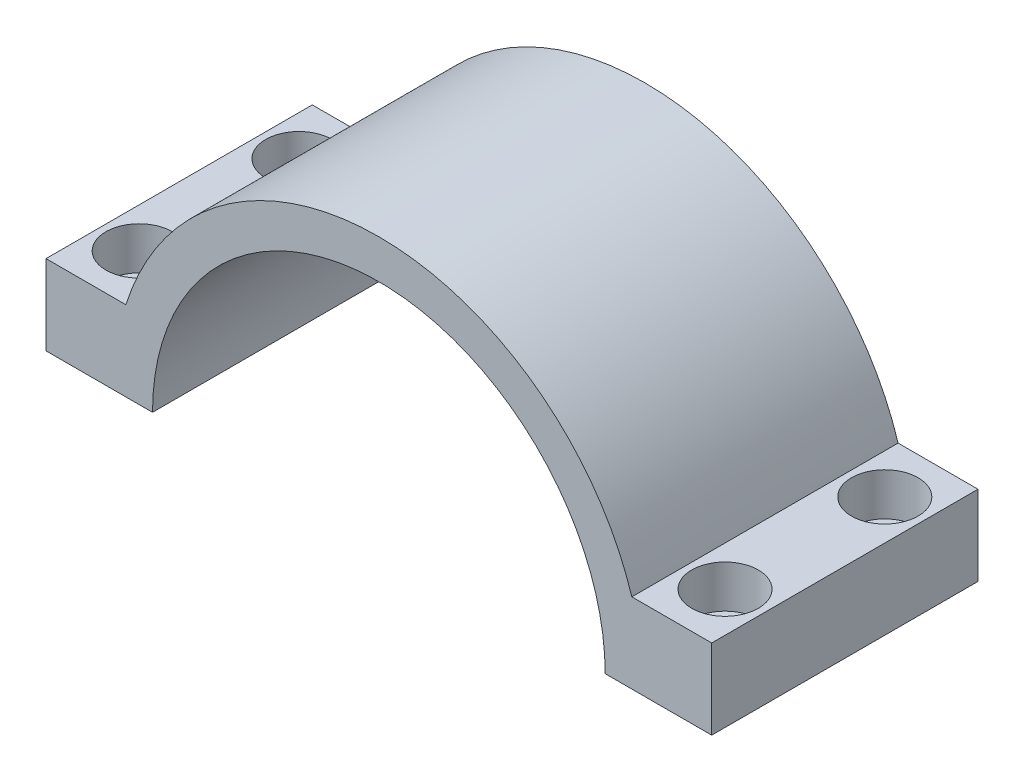
ISO-10303-21;
HEADER;
FILE_DESCRIPTION(('STEP AP214'),'2;1');
FILE_NAME('part.step','',(''),(''),'','','');
FILE_SCHEMA(('AUTOMOTIVE_DESIGN { 1 0 10303 214 1 1 1 1 }'));
ENDSEC;
DATA;
#1=APPLICATION_CONTEXT('core data for automotive mechanical design processes');
#2=APPLICATION_PROTOCOL_DEFINITION('international standard','automotive_design',2000,#1);
#3=PRODUCT_CONTEXT('',#1,'mechanical');
#4=PRODUCT('Part','Part','',(#3));
#5=PRODUCT_RELATED_PRODUCT_CATEGORY('part','',(#4));
#6=PRODUCT_DEFINITION_FORMATION('','',#4);
#7=PRODUCT_DEFINITION_CONTEXT('part definition',#1,'design');
#8=PRODUCT_DEFINITION('design','',#6,#7);
#9=PRODUCT_DEFINITION_SHAPE('','',#8);
#10=(LENGTH_UNIT() NAMED_UNIT(*) SI_UNIT(.MILLI.,.METRE.));
#11=(NAMED_UNIT(*) PLANE_ANGLE_UNIT() SI_UNIT($,.RADIAN.));
#12=(NAMED_UNIT(*) SI_UNIT($,.STERADIAN.) SOLID_ANGLE_UNIT());
#13=UNCERTAINTY_MEASURE_WITH_UNIT(LENGTH_MEASURE(1.E-05),#10,'distance_accuracy_value','');
#14=(GEOMETRIC_REPRESENTATION_CONTEXT(3) GLOBAL_UNCERTAINTY_ASSIGNED_CONTEXT((#13)) GLOBAL_UNIT_ASSIGNED_CONTEXT((#10,
#11,#12)) REPRESENTATION_CONTEXT('',''));
#15=CARTESIAN_POINT('',(0.,0.,0.));
#16=DIRECTION('',(0.,0.,1.));
#17=DIRECTION('',(1.,0.,0.));
#18=AXIS2_PLACEMENT_3D('',#15,#16,#17);
#19=CARTESIAN_POINT('',(0.,0.,10.));
#20=DIRECTION('',(0.,0.,-1.));
#21=DIRECTION('',(-1.,0.,0.));
#22=AXIS2_PLACEMENT_3D('',#19,#20,#21);
#23=CYLINDRICAL_SURFACE('',#22,9.96242942258564);
#24=CARTESIAN_POINT('',(0.,0.,0.));
#25=DIRECTION('',(0.,0.,1.));
#26=DIRECTION('',(1.,0.,0.));
#27=AXIS2_PLACEMENT_3D('',#24,#25,#26);
#28=CIRCLE('',#27,9.96242942258564);
#29=CARTESIAN_POINT('',(-9.5,3.,0.));
#30=VERTEX_POINT('',#29);
#31=CARTESIAN_POINT('',(9.5,3.,0.));
#32=VERTEX_POINT('',#31);
#33=EDGE_CURVE('E126',#30,#32,#28,.F.);
#34=ORIENTED_EDGE('',*,*,#33,.F.);
#35=DIRECTION('',(0.,0.,-1.));
#36=VECTOR('',#35,1.);
#37=CARTESIAN_POINT('',(-9.5,3.,10.));
#38=LINE('',#37,#36);
#39=CARTESIAN_POINT('',(-9.5,3.,10.));
#40=VERTEX_POINT('',#39);
#41=EDGE_CURVE('E11',#40,#30,#38,.T.);
#42=ORIENTED_EDGE('',*,*,#41,.F.);
#43=CARTESIAN_POINT('',(0.,0.,10.));
#44=DIRECTION('',(0.,0.,1.));
#45=DIRECTION('',(1.,0.,0.));
#46=AXIS2_PLACEMENT_3D('',#43,#44,#45);
#47=CIRCLE('',#46,9.96242942258564);
#48=CARTESIAN_POINT('',(9.5,3.,10.));
#49=VERTEX_POINT('',#48);
#50=EDGE_CURVE('E146',#40,#49,#47,.F.);
#51=ORIENTED_EDGE('',*,*,#50,.T.);
#52=DIRECTION('',(0.,0.,-1.));
#53=VECTOR('',#52,1.);
#54=CARTESIAN_POINT('',(9.5,3.,10.));
#55=LINE('',#54,#53);
#56=EDGE_CURVE('E85',#49,#32,#55,.T.);
#57=ORIENTED_EDGE('',*,*,#56,.T.);
#58=EDGE_LOOP('',(#34,#42,#51,#57));
#59=FACE_BOUND('',#58,.T.);
#60=ADVANCED_FACE('F34',(#59),#23,.T.);
#61=CARTESIAN_POINT('',(0.,3.,10.));
#62=DIRECTION('',(0.,1.,0.));
#63=DIRECTION('',(-1.,0.,0.));
#64=AXIS2_PLACEMENT_3D('',#61,#62,#63);
#65=PLANE('',#64);
#66=CARTESIAN_POINT('',(-11.,3.,2.));
#67=DIRECTION('',(0.,1.,0.));
#68=DIRECTION('',(0.,0.,1.));
#69=AXIS2_PLACEMENT_3D('',#66,#67,#68);
#70=CIRCLE('',#69,1.25);
#71=CARTESIAN_POINT('',(-11.,3.,3.25));
#72=VERTEX_POINT('',#71);
#73=EDGE_CURVE('E227',#72,#72,#70,.T.);
#74=ORIENTED_EDGE('',*,*,#73,.F.);
#75=EDGE_LOOP('',(#74));
#76=FACE_BOUND('',#75,.T.);
#77=CARTESIAN_POINT('',(-11.,3.,8.));
#78=DIRECTION('',(0.,1.,0.));
#79=DIRECTION('',(0.,0.,1.));
#80=AXIS2_PLACEMENT_3D('',#77,#78,#79);
#81=CIRCLE('',#80,1.25);
#82=CARTESIAN_POINT('',(-11.,3.,9.25));
#83=VERTEX_POINT('',#82);
#84=EDGE_CURVE('E215',#83,#83,#81,.T.);
#85=ORIENTED_EDGE('',*,*,#84,.F.);
#86=EDGE_LOOP('',(#85));
#87=FACE_BOUND('',#86,.T.);
#88=DIRECTION('',(1.,0.,0.));
#89=VECTOR('',#88,1.);
#90=CARTESIAN_POINT('',(0.,3.,0.));
#91=LINE('',#90,#89);
#92=CARTESIAN_POINT('',(-12.5,3.,0.));
#93=VERTEX_POINT('',#92);
#94=EDGE_CURVE('E129',#93,#30,#91,.T.);
#95=ORIENTED_EDGE('',*,*,#94,.F.);
#96=DIRECTION('',(0.,0.,-1.));
#97=VECTOR('',#96,1.);
#98=CARTESIAN_POINT('',(-12.5,3.,10.));
#99=LINE('',#98,#97);
#100=CARTESIAN_POINT('',(-12.5,3.,10.));
#101=VERTEX_POINT('',#100);
#102=EDGE_CURVE('E42',#101,#93,#99,.T.);
#103=ORIENTED_EDGE('',*,*,#102,.F.);
#104=DIRECTION('',(1.,0.,0.));
#105=VECTOR('',#104,1.);
#106=CARTESIAN_POINT('',(0.,3.,10.));
#107=LINE('',#106,#105);
#108=EDGE_CURVE('E172',#101,#40,#107,.T.);
#109=ORIENTED_EDGE('',*,*,#108,.T.);
#110=ORIENTED_EDGE('',*,*,#41,.T.);
#111=EDGE_LOOP('',(#95,#103,#109,#110));
#112=FACE_BOUND('',#111,.T.);
#113=ADVANCED_FACE('F163',(#76,#87,#112),#65,.T.);
#114=CARTESIAN_POINT('',(-12.5,0.,10.));
#115=DIRECTION('',(-1.,0.,0.));
#116=DIRECTION('',(0.,0.,1.));
#117=AXIS2_PLACEMENT_3D('',#114,#115,#116);
#118=PLANE('',#117);
#119=DIRECTION('',(0.,1.,0.));
#120=VECTOR('',#119,1.);
#121=CARTESIAN_POINT('',(-12.5,0.,0.));
#122=LINE('',#121,#120);
#123=CARTESIAN_POINT('',(-12.5,0.,0.));
#124=VERTEX_POINT('',#123);
#125=EDGE_CURVE('E133',#124,#93,#122,.T.);
#126=ORIENTED_EDGE('',*,*,#125,.F.);
#127=DIRECTION('',(0.,0.,-1.));
#128=VECTOR('',#127,1.);
#129=CARTESIAN_POINT('',(-12.5,0.,10.));
#130=LINE('',#129,#128);
#131=CARTESIAN_POINT('',(-12.5,0.,10.));
#132=VERTEX_POINT('',#131);
#133=EDGE_CURVE('E152',#132,#124,#130,.T.);
#134=ORIENTED_EDGE('',*,*,#133,.F.);
#135=DIRECTION('',(0.,1.,0.));
#136=VECTOR('',#135,1.);
#137=CARTESIAN_POINT('',(-12.5,0.,10.));
#138=LINE('',#137,#136);
#139=EDGE_CURVE('E159',#132,#101,#138,.T.);
#140=ORIENTED_EDGE('',*,*,#139,.T.);
#141=ORIENTED_EDGE('',*,*,#102,.T.);
#142=EDGE_LOOP('',(#126,#134,#140,#141));
#143=FACE_BOUND('',#142,.T.);
#144=ADVANCED_FACE('F157',(#143),#118,.T.);
#145=CARTESIAN_POINT('',(0.,0.,10.));
#146=DIRECTION('',(0.,-1.,0.));
#147=DIRECTION('',(1.,0.,0.));
#148=AXIS2_PLACEMENT_3D('',#145,#146,#147);
#149=PLANE('',#148);
#150=CARTESIAN_POINT('',(-11.,0.,2.));
#151=DIRECTION('',(0.,1.,0.));
#152=DIRECTION('',(0.,0.,1.));
#153=AXIS2_PLACEMENT_3D('',#150,#151,#152);
#154=CIRCLE('',#153,0.999999999999999);
#155=CARTESIAN_POINT('',(-11.,0.,3.));
#156=VERTEX_POINT('',#155);
#157=EDGE_CURVE('E218',#156,#156,#154,.T.);
#158=ORIENTED_EDGE('',*,*,#157,.T.);
#159=EDGE_LOOP('',(#158));
#160=FACE_BOUND('',#159,.T.);
#161=CARTESIAN_POINT('',(-11.,0.,8.));
#162=DIRECTION('',(0.,1.,0.));
#163=DIRECTION('',(0.,0.,1.));
#164=AXIS2_PLACEMENT_3D('',#161,#162,#163);
#165=CIRCLE('',#164,0.999999999999999);
#166=CARTESIAN_POINT('',(-11.,0.,9.));
#167=VERTEX_POINT('',#166);
#168=EDGE_CURVE('E206',#167,#167,#165,.T.);
#169=ORIENTED_EDGE('',*,*,#168,.T.);
#170=EDGE_LOOP('',(#169));
#171=FACE_BOUND('',#170,.T.);
#172=DIRECTION('',(-1.,0.,0.));
#173=VECTOR('',#172,1.);
#174=CARTESIAN_POINT('',(0.,0.,0.));
#175=LINE('',#174,#173);
#176=CARTESIAN_POINT('',(-8.5,0.,0.));
#177=VERTEX_POINT('',#176);
#178=EDGE_CURVE('E136',#177,#124,#175,.T.);
#179=ORIENTED_EDGE('',*,*,#178,.F.);
#180=DIRECTION('',(0.,0.,-1.));
#181=VECTOR('',#180,1.);
#182=CARTESIAN_POINT('',(-8.5,0.,10.));
#183=LINE('',#182,#181);
#184=CARTESIAN_POINT('',(-8.5,0.,10.));
#185=VERTEX_POINT('',#184);
#186=EDGE_CURVE('E150',#185,#177,#183,.T.);
#187=ORIENTED_EDGE('',*,*,#186,.F.);
#188=DIRECTION('',(-1.,0.,0.));
#189=VECTOR('',#188,1.);
#190=CARTESIAN_POINT('',(0.,0.,10.));
#191=LINE('',#190,#189);
#192=EDGE_CURVE('E171',#185,#132,#191,.T.);
#193=ORIENTED_EDGE('',*,*,#192,.T.);
#194=ORIENTED_EDGE('',*,*,#133,.T.);
#195=EDGE_LOOP('',(#179,#187,#193,#194));
#196=FACE_BOUND('',#195,.T.);
#197=ADVANCED_FACE('F169',(#160,#171,#196),#149,.T.);
#198=CARTESIAN_POINT('',(0.,0.,10.));
#199=DIRECTION('',(0.,0.,-1.));
#200=DIRECTION('',(-1.,0.,0.));
#201=AXIS2_PLACEMENT_3D('',#198,#199,#200);
#202=CYLINDRICAL_SURFACE('',#201,8.5);
#203=CARTESIAN_POINT('',(0.,0.,0.));
#204=DIRECTION('',(0.,0.,1.));
#205=DIRECTION('',(1.,0.,0.));
#206=AXIS2_PLACEMENT_3D('',#203,#204,#205);
#207=CIRCLE('',#206,8.5);
#208=CARTESIAN_POINT('',(8.5,0.,0.));
#209=VERTEX_POINT('',#208);
#210=EDGE_CURVE('E139',#209,#177,#207,.T.);
#211=ORIENTED_EDGE('',*,*,#210,.F.);
#212=DIRECTION('',(0.,0.,-1.));
#213=VECTOR('',#212,1.);
#214=CARTESIAN_POINT('',(8.5,0.,10.));
#215=LINE('',#214,#213);
#216=CARTESIAN_POINT('',(8.5,0.,10.));
#217=VERTEX_POINT('',#216);
#218=EDGE_CURVE('E118',#217,#209,#215,.T.);
#219=ORIENTED_EDGE('',*,*,#218,.F.);
#220=CARTESIAN_POINT('',(0.,0.,10.));
#221=DIRECTION('',(0.,0.,1.));
#222=DIRECTION('',(1.,0.,0.));
#223=AXIS2_PLACEMENT_3D('',#220,#221,#222);
#224=CIRCLE('',#223,8.5);
#225=EDGE_CURVE('E111',#217,#185,#224,.T.);
#226=ORIENTED_EDGE('',*,*,#225,.T.);
#227=ORIENTED_EDGE('',*,*,#186,.T.);
#228=EDGE_LOOP('',(#211,#219,#226,#227));
#229=FACE_BOUND('',#228,.T.);
#230=ADVANCED_FACE('F178',(#229),#202,.F.);
#231=CARTESIAN_POINT('',(0.,0.,10.));
#232=DIRECTION('',(0.,1.,0.));
#233=DIRECTION('',(-1.,0.,0.));
#234=AXIS2_PLACEMENT_3D('',#231,#232,#233);
#235=PLANE('',#234);
#236=CARTESIAN_POINT('',(11.,0.,2.));
#237=DIRECTION('',(0.,1.,0.));
#238=DIRECTION('',(0.,0.,1.));
#239=AXIS2_PLACEMENT_3D('',#236,#237,#238);
#240=CIRCLE('',#239,0.999999999999999);
#241=CARTESIAN_POINT('',(11.,0.,3.));
#242=VERTEX_POINT('',#241);
#243=EDGE_CURVE('E194',#242,#242,#240,.T.);
#244=ORIENTED_EDGE('',*,*,#243,.T.);
#245=EDGE_LOOP('',(#244));
#246=FACE_BOUND('',#245,.T.);
#247=CARTESIAN_POINT('',(11.,0.,8.));
#248=DIRECTION('',(0.,1.,0.));
#249=DIRECTION('',(0.,0.,1.));
#250=AXIS2_PLACEMENT_3D('',#247,#248,#249);
#251=CIRCLE('',#250,0.999999999999999);
#252=CARTESIAN_POINT('',(11.,0.,9.));
#253=VERTEX_POINT('',#252);
#254=EDGE_CURVE('E130',#253,#253,#251,.T.);
#255=ORIENTED_EDGE('',*,*,#254,.T.);
#256=EDGE_LOOP('',(#255));
#257=FACE_BOUND('',#256,.T.);
#258=DIRECTION('',(1.,0.,0.));
#259=VECTOR('',#258,1.);
#260=CARTESIAN_POINT('',(0.,0.,0.));
#261=LINE('',#260,#259);
#262=CARTESIAN_POINT('',(12.5,0.,0.));
#263=VERTEX_POINT('',#262);
#264=EDGE_CURVE('E117',#209,#263,#261,.T.);
#265=ORIENTED_EDGE('',*,*,#264,.T.);
#266=DIRECTION('',(0.,0.,-1.));
#267=VECTOR('',#266,1.);
#268=CARTESIAN_POINT('',(12.5,0.,10.));
#269=LINE('',#268,#267);
#270=CARTESIAN_POINT('',(12.5,0.,10.));
#271=VERTEX_POINT('',#270);
#272=EDGE_CURVE('E114',#271,#263,#269,.T.);
#273=ORIENTED_EDGE('',*,*,#272,.F.);
#274=DIRECTION('',(1.,0.,0.));
#275=VECTOR('',#274,1.);
#276=CARTESIAN_POINT('',(0.,0.,10.));
#277=LINE('',#276,#275);
#278=EDGE_CURVE('E104',#217,#271,#277,.T.);
#279=ORIENTED_EDGE('',*,*,#278,.F.);
#280=ORIENTED_EDGE('',*,*,#218,.T.);
#281=EDGE_LOOP('',(#265,#273,#279,#280));
#282=FACE_BOUND('',#281,.T.);
#283=ADVANCED_FACE('F115',(#246,#257,#282),#235,.F.);
#284=CARTESIAN_POINT('',(12.5,0.,10.));
#285=DIRECTION('',(-1.,0.,0.));
#286=DIRECTION('',(0.,0.,1.));
#287=AXIS2_PLACEMENT_3D('',#284,#285,#286);
#288=PLANE('',#287);
#289=DIRECTION('',(0.,1.,0.));
#290=VECTOR('',#289,1.);
#291=CARTESIAN_POINT('',(12.5,0.,0.));
#292=LINE('',#291,#290);
#293=CARTESIAN_POINT('',(12.5,3.,0.));
#294=VERTEX_POINT('',#293);
#295=EDGE_CURVE('E78',#263,#294,#292,.T.);
#296=ORIENTED_EDGE('',*,*,#295,.T.);
#297=DIRECTION('',(0.,0.,-1.));
#298=VECTOR('',#297,1.);
#299=CARTESIAN_POINT('',(12.5,3.,10.));
#300=LINE('',#299,#298);
#301=CARTESIAN_POINT('',(12.5,3.,10.));
#302=VERTEX_POINT('',#301);
#303=EDGE_CURVE('E119',#302,#294,#300,.T.);
#304=ORIENTED_EDGE('',*,*,#303,.F.);
#305=DIRECTION('',(0.,1.,0.));
#306=VECTOR('',#305,1.);
#307=CARTESIAN_POINT('',(12.5,0.,10.));
#308=LINE('',#307,#306);
#309=EDGE_CURVE('E108',#271,#302,#308,.T.);
#310=ORIENTED_EDGE('',*,*,#309,.F.);
#311=ORIENTED_EDGE('',*,*,#272,.T.);
#312=EDGE_LOOP('',(#296,#304,#310,#311));
#313=FACE_BOUND('',#312,.T.);
#314=ADVANCED_FACE('F121',(#313),#288,.F.);
#315=CARTESIAN_POINT('',(0.,3.,10.));
#316=DIRECTION('',(0.,-1.,0.));
#317=DIRECTION('',(1.,0.,0.));
#318=AXIS2_PLACEMENT_3D('',#315,#316,#317);
#319=PLANE('',#318);
#320=CARTESIAN_POINT('',(11.,3.,2.));
#321=DIRECTION('',(0.,1.,0.));
#322=DIRECTION('',(0.,0.,1.));
#323=AXIS2_PLACEMENT_3D('',#320,#321,#322);
#324=CIRCLE('',#323,1.25);
#325=CARTESIAN_POINT('',(11.,3.,3.25));
#326=VERTEX_POINT('',#325);
#327=EDGE_CURVE('E203',#326,#326,#324,.T.);
#328=ORIENTED_EDGE('',*,*,#327,.F.);
#329=EDGE_LOOP('',(#328));
#330=FACE_BOUND('',#329,.T.);
#331=CARTESIAN_POINT('',(11.,3.,8.));
#332=DIRECTION('',(0.,1.,0.));
#333=DIRECTION('',(0.,0.,1.));
#334=AXIS2_PLACEMENT_3D('',#331,#332,#333);
#335=CIRCLE('',#334,1.25);
#336=CARTESIAN_POINT('',(11.,3.,9.25));
#337=VERTEX_POINT('',#336);
#338=EDGE_CURVE('E191',#337,#337,#335,.T.);
#339=ORIENTED_EDGE('',*,*,#338,.F.);
#340=EDGE_LOOP('',(#339));
#341=FACE_BOUND('',#340,.T.);
#342=DIRECTION('',(-1.,0.,0.));
#343=VECTOR('',#342,1.);
#344=CARTESIAN_POINT('',(0.,3.,0.));
#345=LINE('',#344,#343);
#346=EDGE_CURVE('E144',#294,#32,#345,.T.);
#347=ORIENTED_EDGE('',*,*,#346,.T.);
#348=ORIENTED_EDGE('',*,*,#56,.F.);
#349=DIRECTION('',(-1.,0.,0.));
#350=VECTOR('',#349,1.);
#351=CARTESIAN_POINT('',(0.,3.,10.));
#352=LINE('',#351,#350);
#353=EDGE_CURVE('E50',#302,#49,#352,.T.);
#354=ORIENTED_EDGE('',*,*,#353,.F.);
#355=ORIENTED_EDGE('',*,*,#303,.T.);
#356=EDGE_LOOP('',(#347,#348,#354,#355));
#357=FACE_BOUND('',#356,.T.);
#358=ADVANCED_FACE('F181',(#330,#341,#357),#319,.F.);
#359=CARTESIAN_POINT('',(0.,0.,10.));
#360=DIRECTION('',(0.,0.,1.));
#361=DIRECTION('',(1.,0.,0.));
#362=AXIS2_PLACEMENT_3D('',#359,#360,#361);
#363=PLANE('',#362);
#364=ORIENTED_EDGE('',*,*,#50,.F.);
#365=ORIENTED_EDGE('',*,*,#108,.F.);
#366=ORIENTED_EDGE('',*,*,#139,.F.);
#367=ORIENTED_EDGE('',*,*,#192,.F.);
#368=ORIENTED_EDGE('',*,*,#225,.F.);
#369=ORIENTED_EDGE('',*,*,#278,.T.);
#370=ORIENTED_EDGE('',*,*,#309,.T.);
#371=ORIENTED_EDGE('',*,*,#353,.T.);
#372=EDGE_LOOP('',(#364,#365,#366,#367,#368,#369,#370,#371));
#373=FACE_BOUND('',#372,.T.);
#374=ADVANCED_FACE('F106',(#373),#363,.T.);
#375=CARTESIAN_POINT('',(0.,0.,0.));
#376=DIRECTION('',(0.,0.,1.));
#377=DIRECTION('',(1.,0.,0.));
#378=AXIS2_PLACEMENT_3D('',#375,#376,#377);
#379=PLANE('',#378);
#380=ORIENTED_EDGE('',*,*,#33,.T.);
#381=ORIENTED_EDGE('',*,*,#346,.F.);
#382=ORIENTED_EDGE('',*,*,#295,.F.);
#383=ORIENTED_EDGE('',*,*,#264,.F.);
#384=ORIENTED_EDGE('',*,*,#210,.T.);
#385=ORIENTED_EDGE('',*,*,#178,.T.);
#386=ORIENTED_EDGE('',*,*,#125,.T.);
#387=ORIENTED_EDGE('',*,*,#94,.T.);
#388=EDGE_LOOP('',(#380,#381,#382,#383,#384,#385,#386,#387));
#389=FACE_BOUND('',#388,.T.);
#390=ADVANCED_FACE('F165',(#389),#379,.F.);
#391=CARTESIAN_POINT('',(11.,3.,8.));
#392=DIRECTION('',(0.,1.,0.));
#393=DIRECTION('',(0.,0.,1.));
#394=AXIS2_PLACEMENT_3D('',#391,#392,#393);
#395=CYLINDRICAL_SURFACE('',#394,0.999999999999999);
#396=ORIENTED_EDGE('',*,*,#254,.F.);
#397=EDGE_LOOP('',(#396));
#398=FACE_BOUND('',#397,.T.);
#399=CARTESIAN_POINT('',(11.,1.4,8.));
#400=DIRECTION('',(0.,1.,0.));
#401=DIRECTION('',(0.,0.,1.));
#402=AXIS2_PLACEMENT_3D('',#399,#400,#401);
#403=CIRCLE('',#402,0.999999999999999);
#404=CARTESIAN_POINT('',(11.,1.4,9.));
#405=VERTEX_POINT('',#404);
#406=EDGE_CURVE('E185',#405,#405,#403,.T.);
#407=ORIENTED_EDGE('',*,*,#406,.T.);
#408=EDGE_LOOP('',(#407));
#409=FACE_BOUND('',#408,.T.);
#410=ADVANCED_FACE('F313',(#398,#409),#395,.F.);
#411=CARTESIAN_POINT('',(12.,1.4,8.));
#412=DIRECTION('',(0.,-1.,0.));
#413=DIRECTION('',(0.,0.,-1.));
#414=AXIS2_PLACEMENT_3D('',#411,#412,#413);
#415=PLANE('',#414);
#416=ORIENTED_EDGE('',*,*,#406,.F.);
#417=EDGE_LOOP('',(#416));
#418=FACE_BOUND('',#417,.T.);
#419=CARTESIAN_POINT('',(11.,1.4,8.));
#420=DIRECTION('',(0.,1.,0.));
#421=DIRECTION('',(0.,0.,1.));
#422=AXIS2_PLACEMENT_3D('',#419,#420,#421);
#423=CIRCLE('',#422,1.25);
#424=CARTESIAN_POINT('',(11.,1.4,9.25));
#425=VERTEX_POINT('',#424);
#426=EDGE_CURVE('E188',#425,#425,#423,.T.);
#427=ORIENTED_EDGE('',*,*,#426,.T.);
#428=EDGE_LOOP('',(#427));
#429=FACE_BOUND('',#428,.T.);
#430=ADVANCED_FACE('F319',(#418,#429),#415,.F.);
#431=CARTESIAN_POINT('',(11.,3.,8.));
#432=DIRECTION('',(0.,1.,0.));
#433=DIRECTION('',(0.,0.,1.));
#434=AXIS2_PLACEMENT_3D('',#431,#432,#433);
#435=CYLINDRICAL_SURFACE('',#434,1.25);
#436=ORIENTED_EDGE('',*,*,#426,.F.);
#437=EDGE_LOOP('',(#436));
#438=FACE_BOUND('',#437,.T.);
#439=ORIENTED_EDGE('',*,*,#338,.T.);
#440=EDGE_LOOP('',(#439));
#441=FACE_BOUND('',#440,.T.);
#442=ADVANCED_FACE('F327',(#438,#441),#435,.F.);
#443=CARTESIAN_POINT('',(11.,3.,2.));
#444=DIRECTION('',(0.,1.,0.));
#445=DIRECTION('',(0.,0.,1.));
#446=AXIS2_PLACEMENT_3D('',#443,#444,#445);
#447=CYLINDRICAL_SURFACE('',#446,0.999999999999999);
#448=ORIENTED_EDGE('',*,*,#243,.F.);
#449=EDGE_LOOP('',(#448));
#450=FACE_BOUND('',#449,.T.);
#451=CARTESIAN_POINT('',(11.,1.4,2.));
#452=DIRECTION('',(0.,1.,0.));
#453=DIRECTION('',(0.,0.,1.));
#454=AXIS2_PLACEMENT_3D('',#451,#452,#453);
#455=CIRCLE('',#454,0.999999999999999);
#456=CARTESIAN_POINT('',(11.,1.4,3.));
#457=VERTEX_POINT('',#456);
#458=EDGE_CURVE('E197',#457,#457,#455,.T.);
#459=ORIENTED_EDGE('',*,*,#458,.T.);
#460=EDGE_LOOP('',(#459));
#461=FACE_BOUND('',#460,.T.);
#462=ADVANCED_FACE('F335',(#450,#461),#447,.F.);
#463=CARTESIAN_POINT('',(12.,1.4,2.));
#464=DIRECTION('',(0.,-1.,0.));
#465=DIRECTION('',(0.,0.,-1.));
#466=AXIS2_PLACEMENT_3D('',#463,#464,#465);
#467=PLANE('',#466);
#468=ORIENTED_EDGE('',*,*,#458,.F.);
#469=EDGE_LOOP('',(#468));
#470=FACE_BOUND('',#469,.T.);
#471=CARTESIAN_POINT('',(11.,1.4,2.));
#472=DIRECTION('',(0.,1.,0.));
#473=DIRECTION('',(0.,0.,1.));
#474=AXIS2_PLACEMENT_3D('',#471,#472,#473);
#475=CIRCLE('',#474,1.25);
#476=CARTESIAN_POINT('',(11.,1.4,3.25));
#477=VERTEX_POINT('',#476);
#478=EDGE_CURVE('E200',#477,#477,#475,.T.);
#479=ORIENTED_EDGE('',*,*,#478,.T.);
#480=EDGE_LOOP('',(#479));
#481=FACE_BOUND('',#480,.T.);
#482=ADVANCED_FACE('F343',(#470,#481),#467,.F.);
#483=CARTESIAN_POINT('',(11.,3.,2.));
#484=DIRECTION('',(0.,1.,0.));
#485=DIRECTION('',(0.,0.,1.));
#486=AXIS2_PLACEMENT_3D('',#483,#484,#485);
#487=CYLINDRICAL_SURFACE('',#486,1.25);
#488=ORIENTED_EDGE('',*,*,#478,.F.);
#489=EDGE_LOOP('',(#488));
#490=FACE_BOUND('',#489,.T.);
#491=ORIENTED_EDGE('',*,*,#327,.T.);
#492=EDGE_LOOP('',(#491));
#493=FACE_BOUND('',#492,.T.);
#494=ADVANCED_FACE('F351',(#490,#493),#487,.F.);
#495=CARTESIAN_POINT('',(-11.,3.,8.));
#496=DIRECTION('',(0.,1.,0.));
#497=DIRECTION('',(0.,0.,1.));
#498=AXIS2_PLACEMENT_3D('',#495,#496,#497);
#499=CYLINDRICAL_SURFACE('',#498,0.999999999999999);
#500=ORIENTED_EDGE('',*,*,#168,.F.);
#501=EDGE_LOOP('',(#500));
#502=FACE_BOUND('',#501,.T.);
#503=CARTESIAN_POINT('',(-11.,1.4,8.));
#504=DIRECTION('',(0.,1.,0.));
#505=DIRECTION('',(0.,0.,1.));
#506=AXIS2_PLACEMENT_3D('',#503,#504,#505);
#507=CIRCLE('',#506,0.999999999999999);
#508=CARTESIAN_POINT('',(-11.,1.4,9.));
#509=VERTEX_POINT('',#508);
#510=EDGE_CURVE('E209',#509,#509,#507,.T.);
#511=ORIENTED_EDGE('',*,*,#510,.T.);
#512=EDGE_LOOP('',(#511));
#513=FACE_BOUND('',#512,.T.);
#514=ADVANCED_FACE('F250',(#502,#513),#499,.F.);
#515=CARTESIAN_POINT('',(-10.,1.4,8.));
#516=DIRECTION('',(0.,-1.,0.));
#517=DIRECTION('',(0.,0.,-1.));
#518=AXIS2_PLACEMENT_3D('',#515,#516,#517);
#519=PLANE('',#518);
#520=ORIENTED_EDGE('',*,*,#510,.F.);
#521=EDGE_LOOP('',(#520));
#522=FACE_BOUND('',#521,.T.);
#523=CARTESIAN_POINT('',(-11.,1.4,8.));
#524=DIRECTION('',(0.,1.,0.));
#525=DIRECTION('',(0.,0.,1.));
#526=AXIS2_PLACEMENT_3D('',#523,#524,#525);
#527=CIRCLE('',#526,1.25);
#528=CARTESIAN_POINT('',(-11.,1.4,9.25));
#529=VERTEX_POINT('',#528);
#530=EDGE_CURVE('E212',#529,#529,#527,.T.);
#531=ORIENTED_EDGE('',*,*,#530,.T.);
#532=EDGE_LOOP('',(#531));
#533=FACE_BOUND('',#532,.T.);
#534=ADVANCED_FACE('F240',(#522,#533),#519,.F.);
#535=CARTESIAN_POINT('',(-11.,3.,8.));
#536=DIRECTION('',(0.,1.,0.));
#537=DIRECTION('',(0.,0.,1.));
#538=AXIS2_PLACEMENT_3D('',#535,#536,#537);
#539=CYLINDRICAL_SURFACE('',#538,1.25);
#540=ORIENTED_EDGE('',*,*,#530,.F.);
#541=EDGE_LOOP('',(#540));
#542=FACE_BOUND('',#541,.T.);
#543=ORIENTED_EDGE('',*,*,#84,.T.);
#544=EDGE_LOOP('',(#543));
#545=FACE_BOUND('',#544,.T.);
#546=ADVANCED_FACE('F237',(#542,#545),#539,.F.);
#547=CARTESIAN_POINT('',(-11.,3.,2.));
#548=DIRECTION('',(0.,1.,0.));
#549=DIRECTION('',(0.,0.,1.));
#550=AXIS2_PLACEMENT_3D('',#547,#548,#549);
#551=CYLINDRICAL_SURFACE('',#550,0.999999999999999);
#552=ORIENTED_EDGE('',*,*,#157,.F.);
#553=EDGE_LOOP('',(#552));
#554=FACE_BOUND('',#553,.T.);
#555=CARTESIAN_POINT('',(-11.,1.4,2.));
#556=DIRECTION('',(0.,1.,0.));
#557=DIRECTION('',(0.,0.,1.));
#558=AXIS2_PLACEMENT_3D('',#555,#556,#557);
#559=CIRCLE('',#558,0.999999999999999);
#560=CARTESIAN_POINT('',(-11.,1.4,3.));
#561=VERTEX_POINT('',#560);
#562=EDGE_CURVE('E221',#561,#561,#559,.T.);
#563=ORIENTED_EDGE('',*,*,#562,.T.);
#564=EDGE_LOOP('',(#563));
#565=FACE_BOUND('',#564,.T.);
#566=ADVANCED_FACE('F239',(#554,#565),#551,.F.);
#567=CARTESIAN_POINT('',(-10.,1.4,2.));
#568=DIRECTION('',(0.,-1.,0.));
#569=DIRECTION('',(0.,0.,-1.));
#570=AXIS2_PLACEMENT_3D('',#567,#568,#569);
#571=PLANE('',#570);
#572=ORIENTED_EDGE('',*,*,#562,.F.);
#573=EDGE_LOOP('',(#572));
#574=FACE_BOUND('',#573,.T.);
#575=CARTESIAN_POINT('',(-11.,1.4,2.));
#576=DIRECTION('',(0.,1.,0.));
#577=DIRECTION('',(0.,0.,1.));
#578=AXIS2_PLACEMENT_3D('',#575,#576,#577);
#579=CIRCLE('',#578,1.25);
#580=CARTESIAN_POINT('',(-11.,1.4,3.25));
#581=VERTEX_POINT('',#580);
#582=EDGE_CURVE('E224',#581,#581,#579,.T.);
#583=ORIENTED_EDGE('',*,*,#582,.T.);
#584=EDGE_LOOP('',(#583));
#585=FACE_BOUND('',#584,.T.);
#586=ADVANCED_FACE('F247',(#574,#585),#571,.F.);
#587=CARTESIAN_POINT('',(-11.,3.,2.));
#588=DIRECTION('',(0.,1.,0.));
#589=DIRECTION('',(0.,0.,1.));
#590=AXIS2_PLACEMENT_3D('',#587,#588,#589);
#591=CYLINDRICAL_SURFACE('',#590,1.25);
#592=ORIENTED_EDGE('',*,*,#582,.F.);
#593=EDGE_LOOP('',(#592));
#594=FACE_BOUND('',#593,.T.);
#595=ORIENTED_EDGE('',*,*,#73,.T.);
#596=EDGE_LOOP('',(#595));
#597=FACE_BOUND('',#596,.T.);
#598=ADVANCED_FACE('F231',(#594,#597),#591,.F.);
#599=CLOSED_SHELL('',(#60,#113,#144,#197,#230,#283,#314,#358,#374,#390,#410,#430,#442,#462,#482,
#494,#514,#534,#546,#566,#586,#598));
#600=MANIFOLD_SOLID_BREP('B2',#599);
#601=ADVANCED_BREP_SHAPE_REPRESENTATION('',(#18,#600),#14);
#602=SHAPE_DEFINITION_REPRESENTATION(#9,#601);
ENDSEC;
END-ISO-10303-21;
